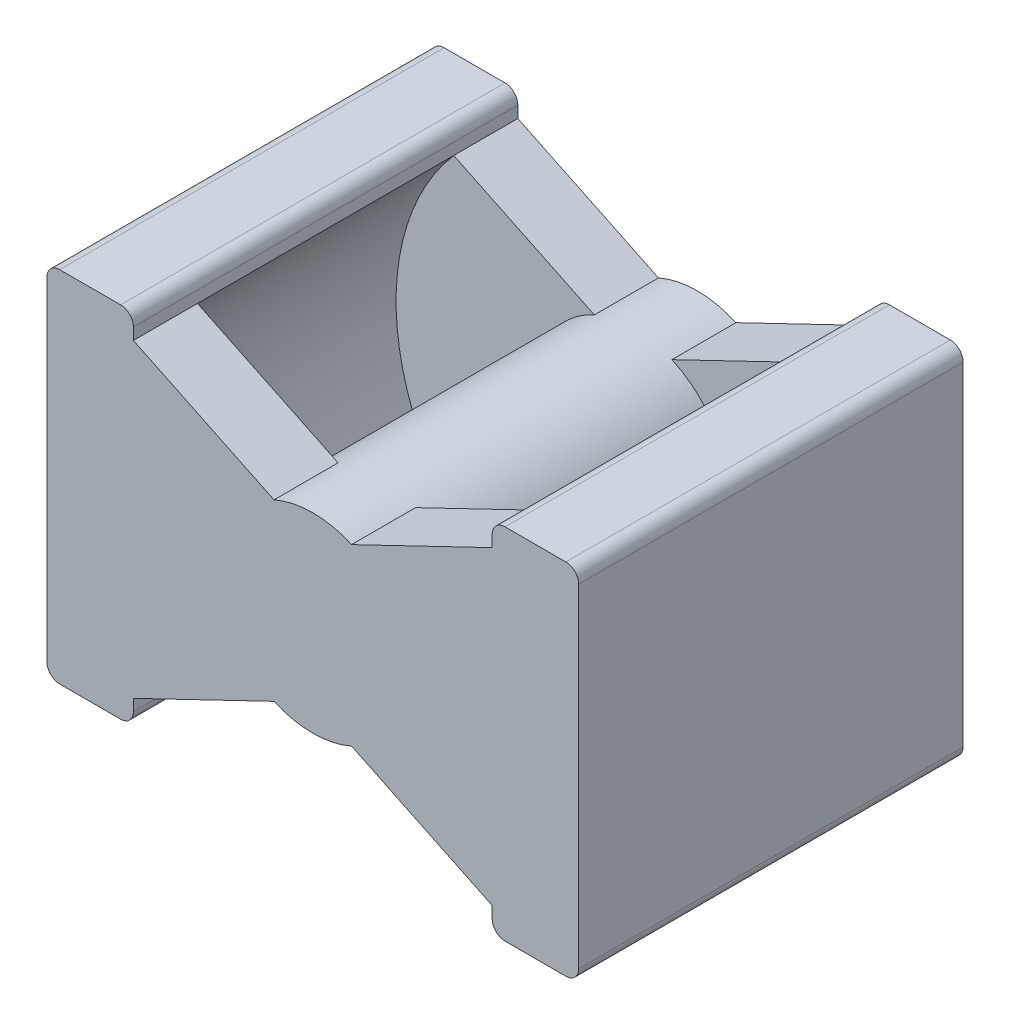
ISO-10303-21;
HEADER;
FILE_DESCRIPTION(('STEP AP214'),'2;1');
FILE_NAME('part.step','',(''),(''),'','','');
FILE_SCHEMA(('AUTOMOTIVE_DESIGN { 1 0 10303 214 1 1 1 1 }'));
ENDSEC;
DATA;
#1=APPLICATION_CONTEXT('core data for automotive mechanical design processes');
#2=APPLICATION_PROTOCOL_DEFINITION('international standard','automotive_design',2000,#1);
#3=PRODUCT_CONTEXT('',#1,'mechanical');
#4=PRODUCT('Part','Part','',(#3));
#5=PRODUCT_RELATED_PRODUCT_CATEGORY('part','',(#4));
#6=PRODUCT_DEFINITION_FORMATION('','',#4);
#7=PRODUCT_DEFINITION_CONTEXT('part definition',#1,'design');
#8=PRODUCT_DEFINITION('design','',#6,#7);
#9=PRODUCT_DEFINITION_SHAPE('','',#8);
#10=(LENGTH_UNIT() NAMED_UNIT(*) SI_UNIT(.MILLI.,.METRE.));
#11=(NAMED_UNIT(*) PLANE_ANGLE_UNIT() SI_UNIT($,.RADIAN.));
#12=(NAMED_UNIT(*) SI_UNIT($,.STERADIAN.) SOLID_ANGLE_UNIT());
#13=UNCERTAINTY_MEASURE_WITH_UNIT(LENGTH_MEASURE(1.E-05),#10,'distance_accuracy_value','');
#14=(GEOMETRIC_REPRESENTATION_CONTEXT(3) GLOBAL_UNCERTAINTY_ASSIGNED_CONTEXT((#13)) GLOBAL_UNIT_ASSIGNED_CONTEXT((#10,
#11,#12)) REPRESENTATION_CONTEXT('',''));
#15=CARTESIAN_POINT('',(0.,0.,0.));
#16=DIRECTION('',(0.,0.,1.));
#17=DIRECTION('',(1.,0.,0.));
#18=AXIS2_PLACEMENT_3D('',#15,#16,#17);
#19=CARTESIAN_POINT('',(0.525361672592803,-1.09094868808785,30.));
#20=DIRECTION('',(-0.433876012191163,0.900972588953234,0.));
#21=DIRECTION('',(-0.900972588953234,-0.433876012191164,0.));
#22=AXIS2_PLACEMENT_3D('',#19,#20,#21);
#23=PLANE('',#22);
#24=DIRECTION('',(-0.900972588953234,-0.433876012191164,0.));
#25=VECTOR('',#24,1.);
#26=CARTESIAN_POINT('',(0.525361672592803,-1.09094868808785,25.));
#27=LINE('',#26,#25);
#28=CARTESIAN_POINT('',(17.725,7.19177886669359,25.));
#29=VERTEX_POINT('',#28);
#30=CARTESIAN_POINT('',(6.75,1.90661337755218,25.));
#31=VERTEX_POINT('',#30);
#32=EDGE_CURVE('E518',#29,#31,#27,.T.);
#33=ORIENTED_EDGE('',*,*,#32,.F.);
#34=DIRECTION('',(0.,0.,-1.));
#35=VECTOR('',#34,1.);
#36=CARTESIAN_POINT('',(17.725,7.19177886669359,30.));
#37=LINE('',#36,#35);
#38=CARTESIAN_POINT('',(17.725,7.19177886669359,30.));
#39=VERTEX_POINT('',#38);
#40=EDGE_CURVE('E11',#39,#29,#37,.T.);
#41=ORIENTED_EDGE('',*,*,#40,.F.);
#42=DIRECTION('',(0.900972588953234,0.433876012191164,0.));
#43=VECTOR('',#42,1.);
#44=CARTESIAN_POINT('',(0.525361672592803,-1.09094868808785,30.));
#45=LINE('',#44,#43);
#46=CARTESIAN_POINT('',(6.75,1.90661337755218,30.));
#47=VERTEX_POINT('',#46);
#48=EDGE_CURVE('E396',#47,#39,#45,.T.);
#49=ORIENTED_EDGE('',*,*,#48,.F.);
#50=DIRECTION('',(0.,0.,-1.));
#51=VECTOR('',#50,1.);
#52=CARTESIAN_POINT('',(6.75,1.90661337755218,30.));
#53=LINE('',#52,#51);
#54=EDGE_CURVE('E397',#47,#31,#53,.T.);
#55=ORIENTED_EDGE('',*,*,#54,.T.);
#56=EDGE_LOOP('',(#33,#41,#49,#55));
#57=FACE_BOUND('',#56,.T.);
#58=ADVANCED_FACE('F39',(#57),#23,.F.);
#59=CARTESIAN_POINT('',(7.28694667653582,15.1318326624381,30.));
#60=DIRECTION('',(-0.433876012191163,-0.900972588953234,0.));
#61=DIRECTION('',(0.900972588953234,-0.433876012191163,0.));
#62=AXIS2_PLACEMENT_3D('',#59,#60,#61);
#63=PLANE('',#62);
#64=DIRECTION('',(0.,0.,-1.));
#65=VECTOR('',#64,1.);
#66=CARTESIAN_POINT('',(23.775,7.19177886669359,30.));
#67=LINE('',#66,#65);
#68=CARTESIAN_POINT('',(23.775,7.19177886669359,30.));
#69=VERTEX_POINT('',#68);
#70=CARTESIAN_POINT('',(23.775,7.19177886669359,25.));
#71=VERTEX_POINT('',#70);
#72=EDGE_CURVE('E313',#69,#71,#67,.T.);
#73=ORIENTED_EDGE('',*,*,#72,.T.);
#74=DIRECTION('',(0.900972588953234,-0.433876012191163,0.));
#75=VECTOR('',#74,1.);
#76=CARTESIAN_POINT('',(7.28694667653582,15.1318326624381,25.));
#77=LINE('',#76,#75);
#78=CARTESIAN_POINT('',(34.75,1.90661337755219,25.));
#79=VERTEX_POINT('',#78);
#80=EDGE_CURVE('E512',#71,#79,#77,.T.);
#81=ORIENTED_EDGE('',*,*,#80,.T.);
#82=DIRECTION('',(0.,0.,-1.));
#83=VECTOR('',#82,1.);
#84=CARTESIAN_POINT('',(34.75,1.90661337755218,30.));
#85=LINE('',#84,#83);
#86=CARTESIAN_POINT('',(34.75,1.90661337755218,30.));
#87=VERTEX_POINT('',#86);
#88=EDGE_CURVE('E310',#87,#79,#85,.T.);
#89=ORIENTED_EDGE('',*,*,#88,.F.);
#90=DIRECTION('',(-0.900972588953234,0.433876012191163,0.));
#91=VECTOR('',#90,1.);
#92=CARTESIAN_POINT('',(7.28694667653582,15.1318326624381,30.));
#93=LINE('',#92,#91);
#94=EDGE_CURVE('E470',#87,#69,#93,.T.);
#95=ORIENTED_EDGE('',*,*,#94,.T.);
#96=EDGE_LOOP('',(#73,#81,#89,#95));
#97=FACE_BOUND('',#96,.T.);
#98=ADVANCED_FACE('F558',(#97),#63,.T.);
#99=CARTESIAN_POINT('',(-3.65854435514435,7.59721230682451,30.));
#100=DIRECTION('',(0.433876012191163,-0.900972588953234,0.));
#101=DIRECTION('',(0.900972588953234,0.433876012191163,0.));
#102=AXIS2_PLACEMENT_3D('',#99,#100,#101);
#103=PLANE('',#102);
#104=DIRECTION('',(0.900972588953234,0.433876012191163,0.));
#105=VECTOR('',#104,1.);
#106=CARTESIAN_POINT('',(-3.65854435514435,7.59721230682451,25.));
#107=LINE('',#106,#105);
#108=CARTESIAN_POINT('',(23.775,20.8082211333064,25.));
#109=VERTEX_POINT('',#108);
#110=CARTESIAN_POINT('',(34.75,26.0933866224478,25.));
#111=VERTEX_POINT('',#110);
#112=EDGE_CURVE('E510',#109,#111,#107,.T.);
#113=ORIENTED_EDGE('',*,*,#112,.F.);
#114=DIRECTION('',(0.,0.,-1.));
#115=VECTOR('',#114,1.);
#116=CARTESIAN_POINT('',(23.775,20.8082211333064,30.));
#117=LINE('',#116,#115);
#118=CARTESIAN_POINT('',(23.775,20.8082211333064,30.));
#119=VERTEX_POINT('',#118);
#120=EDGE_CURVE('E282',#119,#109,#117,.T.);
#121=ORIENTED_EDGE('',*,*,#120,.F.);
#122=DIRECTION('',(-0.900972588953234,-0.433876012191163,0.));
#123=VECTOR('',#122,1.);
#124=CARTESIAN_POINT('',(-3.65854435514435,7.59721230682451,30.));
#125=LINE('',#124,#123);
#126=CARTESIAN_POINT('',(34.75,26.0933866224478,30.));
#127=VERTEX_POINT('',#126);
#128=EDGE_CURVE('E494',#127,#119,#125,.T.);
#129=ORIENTED_EDGE('',*,*,#128,.F.);
#130=DIRECTION('',(0.,0.,-1.));
#131=VECTOR('',#130,1.);
#132=CARTESIAN_POINT('',(34.75,26.0933866224478,30.));
#133=LINE('',#132,#131);
#134=EDGE_CURVE('E286',#127,#111,#133,.T.);
#135=ORIENTED_EDGE('',*,*,#134,.T.);
#136=EDGE_LOOP('',(#113,#121,#129,#135));
#137=FACE_BOUND('',#136,.T.);
#138=ADVANCED_FACE('F607',(#137),#103,.F.);
#139=CARTESIAN_POINT('',(11.470852704273,23.8199936573505,30.));
#140=DIRECTION('',(0.433876012191164,0.900972588953234,0.));
#141=DIRECTION('',(-0.900972588953234,0.433876012191164,0.));
#142=AXIS2_PLACEMENT_3D('',#139,#140,#141);
#143=PLANE('',#142);
#144=DIRECTION('',(0.,0.,-1.));
#145=VECTOR('',#144,1.);
#146=CARTESIAN_POINT('',(17.725,20.8082211333064,30.));
#147=LINE('',#146,#145);
#148=CARTESIAN_POINT('',(17.725,20.8082211333064,30.));
#149=VERTEX_POINT('',#148);
#150=CARTESIAN_POINT('',(17.725,20.8082211333064,25.));
#151=VERTEX_POINT('',#150);
#152=EDGE_CURVE('E273',#149,#151,#147,.T.);
#153=ORIENTED_EDGE('',*,*,#152,.T.);
#154=DIRECTION('',(-0.900972588953234,0.433876012191164,0.));
#155=VECTOR('',#154,1.);
#156=CARTESIAN_POINT('',(11.470852704273,23.8199936573505,25.));
#157=LINE('',#156,#155);
#158=CARTESIAN_POINT('',(6.75,26.0933866224478,25.));
#159=VERTEX_POINT('',#158);
#160=EDGE_CURVE('E506',#151,#159,#157,.T.);
#161=ORIENTED_EDGE('',*,*,#160,.T.);
#162=DIRECTION('',(0.,0.,-1.));
#163=VECTOR('',#162,1.);
#164=CARTESIAN_POINT('',(6.75,26.0933866224478,30.));
#165=LINE('',#164,#163);
#166=CARTESIAN_POINT('',(6.75,26.0933866224478,30.));
#167=VERTEX_POINT('',#166);
#168=EDGE_CURVE('E274',#167,#159,#165,.T.);
#169=ORIENTED_EDGE('',*,*,#168,.F.);
#170=DIRECTION('',(0.900972588953234,-0.433876012191164,0.));
#171=VECTOR('',#170,1.);
#172=CARTESIAN_POINT('',(11.470852704273,23.8199936573505,30.));
#173=LINE('',#172,#171);
#174=EDGE_CURVE('E496',#167,#149,#173,.T.);
#175=ORIENTED_EDGE('',*,*,#174,.T.);
#176=EDGE_LOOP('',(#153,#161,#169,#175));
#177=FACE_BOUND('',#176,.T.);
#178=ADVANCED_FACE('F504',(#177),#143,.T.);
#179=CARTESIAN_POINT('',(17.725,7.19177886669359,5.));
#180=VERTEX_POINT('',#179);
#181=CARTESIAN_POINT('',(17.725,7.19177886669359,0.));
#182=VERTEX_POINT('',#181);
#183=EDGE_CURVE('E47',#180,#182,#37,.T.);
#184=ORIENTED_EDGE('',*,*,#183,.F.);
#185=DIRECTION('',(-0.900972588953234,-0.433876012191164,0.));
#186=VECTOR('',#185,1.);
#187=CARTESIAN_POINT('',(0.525361672592803,-1.09094868808785,5.));
#188=LINE('',#187,#186);
#189=CARTESIAN_POINT('',(6.75,1.90661337755218,5.));
#190=VERTEX_POINT('',#189);
#191=EDGE_CURVE('E255',#180,#190,#188,.T.);
#192=ORIENTED_EDGE('',*,*,#191,.T.);
#193=CARTESIAN_POINT('',(6.75,1.90661337755218,0.));
#194=VERTEX_POINT('',#193);
#195=EDGE_CURVE('E402',#190,#194,#53,.T.);
#196=ORIENTED_EDGE('',*,*,#195,.T.);
#197=DIRECTION('',(0.900972588953234,0.433876012191164,0.));
#198=VECTOR('',#197,1.);
#199=CARTESIAN_POINT('',(0.525361672592803,-1.09094868808785,0.));
#200=LINE('',#199,#198);
#201=EDGE_CURVE('E333',#194,#182,#200,.T.);
#202=ORIENTED_EDGE('',*,*,#201,.T.);
#203=EDGE_LOOP('',(#184,#192,#196,#202));
#204=FACE_BOUND('',#203,.T.);
#205=ADVANCED_FACE('F41',(#204),#23,.F.);
#206=DIRECTION('',(0.900972588953234,-0.433876012191163,0.));
#207=VECTOR('',#206,1.);
#208=CARTESIAN_POINT('',(7.28694667653582,15.1318326624381,5.));
#209=LINE('',#208,#207);
#210=CARTESIAN_POINT('',(23.775,7.19177886669359,5.));
#211=VERTEX_POINT('',#210);
#212=CARTESIAN_POINT('',(34.75,1.90661337755218,5.));
#213=VERTEX_POINT('',#212);
#214=EDGE_CURVE('E327',#211,#213,#209,.T.);
#215=ORIENTED_EDGE('',*,*,#214,.F.);
#216=CARTESIAN_POINT('',(23.775,7.19177886669359,0.));
#217=VERTEX_POINT('',#216);
#218=EDGE_CURVE('E312',#211,#217,#67,.T.);
#219=ORIENTED_EDGE('',*,*,#218,.T.);
#220=DIRECTION('',(-0.900972588953234,0.433876012191163,0.));
#221=VECTOR('',#220,1.);
#222=CARTESIAN_POINT('',(7.28694667653582,15.1318326624381,0.));
#223=LINE('',#222,#221);
#224=CARTESIAN_POINT('',(34.75,1.90661337755218,0.));
#225=VERTEX_POINT('',#224);
#226=EDGE_CURVE('E326',#225,#217,#223,.T.);
#227=ORIENTED_EDGE('',*,*,#226,.F.);
#228=EDGE_CURVE('E309',#213,#225,#85,.T.);
#229=ORIENTED_EDGE('',*,*,#228,.F.);
#230=EDGE_LOOP('',(#215,#219,#227,#229));
#231=FACE_BOUND('',#230,.T.);
#232=ADVANCED_FACE('F323',(#231),#63,.T.);
#233=CARTESIAN_POINT('',(34.75,0.,30.));
#234=DIRECTION('',(1.,0.,0.));
#235=DIRECTION('',(0.,0.,-1.));
#236=AXIS2_PLACEMENT_3D('',#233,#234,#235);
#237=PLANE('',#236);
#238=DIRECTION('',(0.,-1.,0.));
#239=VECTOR('',#238,1.);
#240=CARTESIAN_POINT('',(34.75,0.,0.));
#241=LINE('',#240,#239);
#242=CARTESIAN_POINT('',(34.75,1.00000000000001,0.));
#243=VERTEX_POINT('',#242);
#244=EDGE_CURVE('E338',#225,#243,#241,.T.);
#245=ORIENTED_EDGE('',*,*,#244,.T.);
#246=DIRECTION('',(0.,0.,-1.));
#247=VECTOR('',#246,1.);
#248=CARTESIAN_POINT('',(34.75,1.00000000000001,30.));
#249=LINE('',#248,#247);
#250=CARTESIAN_POINT('',(34.75,1.00000000000001,30.));
#251=VERTEX_POINT('',#250);
#252=EDGE_CURVE('E306',#251,#243,#249,.T.);
#253=ORIENTED_EDGE('',*,*,#252,.F.);
#254=DIRECTION('',(0.,-1.,0.));
#255=VECTOR('',#254,1.);
#256=CARTESIAN_POINT('',(34.75,0.,30.));
#257=LINE('',#256,#255);
#258=EDGE_CURVE('E473',#87,#251,#257,.T.);
#259=ORIENTED_EDGE('',*,*,#258,.F.);
#260=ORIENTED_EDGE('',*,*,#88,.T.);
#261=DIRECTION('',(0.,0.,-1.));
#262=VECTOR('',#261,1.);
#263=CARTESIAN_POINT('',(34.75,1.90661337755219,25.));
#264=LINE('',#263,#262);
#265=EDGE_CURVE('E456',#79,#213,#264,.T.);
#266=ORIENTED_EDGE('',*,*,#265,.T.);
#267=ORIENTED_EDGE('',*,*,#228,.T.);
#268=EDGE_LOOP('',(#245,#253,#259,#260,#266,#267));
#269=FACE_BOUND('',#268,.T.);
#270=ADVANCED_FACE('F536',(#269),#237,.F.);
#271=CARTESIAN_POINT('',(35.75,1.,30.));
#272=DIRECTION('',(0.,0.,-1.));
#273=DIRECTION('',(-1.,0.,0.));
#274=AXIS2_PLACEMENT_3D('',#271,#272,#273);
#275=CYLINDRICAL_SURFACE('',#274,1.);
#276=CARTESIAN_POINT('',(35.75,1.,0.));
#277=DIRECTION('',(0.,0.,1.));
#278=DIRECTION('',(1.,0.,0.));
#279=AXIS2_PLACEMENT_3D('',#276,#277,#278);
#280=CIRCLE('',#279,1.);
#281=CARTESIAN_POINT('',(35.75,0.,0.));
#282=VERTEX_POINT('',#281);
#283=EDGE_CURVE('E340',#243,#282,#280,.T.);
#284=ORIENTED_EDGE('',*,*,#283,.T.);
#285=DIRECTION('',(0.,0.,-1.));
#286=VECTOR('',#285,1.);
#287=CARTESIAN_POINT('',(35.75,0.,30.));
#288=LINE('',#287,#286);
#289=CARTESIAN_POINT('',(35.75,0.,30.));
#290=VERTEX_POINT('',#289);
#291=EDGE_CURVE('E303',#290,#282,#288,.T.);
#292=ORIENTED_EDGE('',*,*,#291,.F.);
#293=CARTESIAN_POINT('',(35.75,1.,30.));
#294=DIRECTION('',(0.,0.,1.));
#295=DIRECTION('',(1.,0.,0.));
#296=AXIS2_PLACEMENT_3D('',#293,#294,#295);
#297=CIRCLE('',#296,1.);
#298=EDGE_CURVE('E475',#251,#290,#297,.T.);
#299=ORIENTED_EDGE('',*,*,#298,.F.);
#300=ORIENTED_EDGE('',*,*,#252,.T.);
#301=EDGE_LOOP('',(#284,#292,#299,#300));
#302=FACE_BOUND('',#301,.T.);
#303=ADVANCED_FACE('F541',(#302),#275,.T.);
#304=CARTESIAN_POINT('',(0.,0.,30.));
#305=DIRECTION('',(0.,1.,0.));
#306=DIRECTION('',(0.,0.,1.));
#307=AXIS2_PLACEMENT_3D('',#304,#305,#306);
#308=PLANE('',#307);
#309=DIRECTION('',(1.,0.,0.));
#310=VECTOR('',#309,1.);
#311=CARTESIAN_POINT('',(0.,0.,0.));
#312=LINE('',#311,#310);
#313=CARTESIAN_POINT('',(40.5,0.,0.));
#314=VERTEX_POINT('',#313);
#315=EDGE_CURVE('E345',#282,#314,#312,.T.);
#316=ORIENTED_EDGE('',*,*,#315,.T.);
#317=DIRECTION('',(0.,0.,-1.));
#318=VECTOR('',#317,1.);
#319=CARTESIAN_POINT('',(40.5,0.,30.));
#320=LINE('',#319,#318);
#321=CARTESIAN_POINT('',(40.5,0.,30.));
#322=VERTEX_POINT('',#321);
#323=EDGE_CURVE('E300',#322,#314,#320,.T.);
#324=ORIENTED_EDGE('',*,*,#323,.F.);
#325=DIRECTION('',(1.,0.,0.));
#326=VECTOR('',#325,1.);
#327=CARTESIAN_POINT('',(0.,0.,30.));
#328=LINE('',#327,#326);
#329=EDGE_CURVE('E477',#290,#322,#328,.T.);
#330=ORIENTED_EDGE('',*,*,#329,.F.);
#331=ORIENTED_EDGE('',*,*,#291,.T.);
#332=EDGE_LOOP('',(#316,#324,#330,#331));
#333=FACE_BOUND('',#332,.T.);
#334=ADVANCED_FACE('F548',(#333),#308,.F.);
#335=CARTESIAN_POINT('',(40.5,1.,30.));
#336=DIRECTION('',(0.,0.,-1.));
#337=DIRECTION('',(-1.,0.,0.));
#338=AXIS2_PLACEMENT_3D('',#335,#336,#337);
#339=CYLINDRICAL_SURFACE('',#338,1.);
#340=CARTESIAN_POINT('',(40.5,1.,0.));
#341=DIRECTION('',(0.,0.,1.));
#342=DIRECTION('',(1.,0.,0.));
#343=AXIS2_PLACEMENT_3D('',#340,#341,#342);
#344=CIRCLE('',#343,1.);
#345=CARTESIAN_POINT('',(41.5,1.00000000000001,0.));
#346=VERTEX_POINT('',#345);
#347=EDGE_CURVE('E347',#314,#346,#344,.T.);
#348=ORIENTED_EDGE('',*,*,#347,.T.);
#349=DIRECTION('',(0.,0.,-1.));
#350=VECTOR('',#349,1.);
#351=CARTESIAN_POINT('',(41.5,1.00000000000001,30.));
#352=LINE('',#351,#350);
#353=CARTESIAN_POINT('',(41.5,1.00000000000001,30.));
#354=VERTEX_POINT('',#353);
#355=EDGE_CURVE('E297',#354,#346,#352,.T.);
#356=ORIENTED_EDGE('',*,*,#355,.F.);
#357=CARTESIAN_POINT('',(40.5,1.,30.));
#358=DIRECTION('',(0.,0.,1.));
#359=DIRECTION('',(1.,0.,0.));
#360=AXIS2_PLACEMENT_3D('',#357,#358,#359);
#361=CIRCLE('',#360,1.);
#362=EDGE_CURVE('E479',#322,#354,#361,.T.);
#363=ORIENTED_EDGE('',*,*,#362,.F.);
#364=ORIENTED_EDGE('',*,*,#323,.T.);
#365=EDGE_LOOP('',(#348,#356,#363,#364));
#366=FACE_BOUND('',#365,.T.);
#367=ADVANCED_FACE('F552',(#366),#339,.T.);
#368=CARTESIAN_POINT('',(41.5,0.,30.));
#369=DIRECTION('',(-1.,0.,0.));
#370=DIRECTION('',(0.,0.,1.));
#371=AXIS2_PLACEMENT_3D('',#368,#369,#370);
#372=PLANE('',#371);
#373=DIRECTION('',(0.,1.,0.));
#374=VECTOR('',#373,1.);
#375=CARTESIAN_POINT('',(41.5,0.,0.));
#376=LINE('',#375,#374);
#377=CARTESIAN_POINT('',(41.5,27.,0.));
#378=VERTEX_POINT('',#377);
#379=EDGE_CURVE('E349',#346,#378,#376,.T.);
#380=ORIENTED_EDGE('',*,*,#379,.T.);
#381=DIRECTION('',(0.,0.,-1.));
#382=VECTOR('',#381,1.);
#383=CARTESIAN_POINT('',(41.5,27.,30.));
#384=LINE('',#383,#382);
#385=CARTESIAN_POINT('',(41.5,27.,30.));
#386=VERTEX_POINT('',#385);
#387=EDGE_CURVE('E295',#386,#378,#384,.T.);
#388=ORIENTED_EDGE('',*,*,#387,.F.);
#389=DIRECTION('',(0.,1.,0.));
#390=VECTOR('',#389,1.);
#391=CARTESIAN_POINT('',(41.5,0.,30.));
#392=LINE('',#391,#390);
#393=EDGE_CURVE('E481',#354,#386,#392,.T.);
#394=ORIENTED_EDGE('',*,*,#393,.F.);
#395=ORIENTED_EDGE('',*,*,#355,.T.);
#396=EDGE_LOOP('',(#380,#388,#394,#395));
#397=FACE_BOUND('',#396,.T.);
#398=ADVANCED_FACE('F647',(#397),#372,.F.);
#399=CARTESIAN_POINT('',(40.5,27.,30.));
#400=DIRECTION('',(0.,0.,-1.));
#401=DIRECTION('',(-1.,0.,0.));
#402=AXIS2_PLACEMENT_3D('',#399,#400,#401);
#403=CYLINDRICAL_SURFACE('',#402,1.);
#404=CARTESIAN_POINT('',(40.5,27.,0.));
#405=DIRECTION('',(0.,0.,1.));
#406=DIRECTION('',(1.,0.,0.));
#407=AXIS2_PLACEMENT_3D('',#404,#405,#406);
#408=CIRCLE('',#407,1.);
#409=CARTESIAN_POINT('',(40.5,28.,0.));
#410=VERTEX_POINT('',#409);
#411=EDGE_CURVE('E352',#410,#378,#408,.F.);
#412=ORIENTED_EDGE('',*,*,#411,.F.);
#413=DIRECTION('',(0.,0.,-1.));
#414=VECTOR('',#413,1.);
#415=CARTESIAN_POINT('',(40.5,28.,30.));
#416=LINE('',#415,#414);
#417=CARTESIAN_POINT('',(40.5,28.,30.));
#418=VERTEX_POINT('',#417);
#419=EDGE_CURVE('E293',#418,#410,#416,.T.);
#420=ORIENTED_EDGE('',*,*,#419,.F.);
#421=CARTESIAN_POINT('',(40.5,27.,30.));
#422=DIRECTION('',(0.,0.,1.));
#423=DIRECTION('',(1.,0.,0.));
#424=AXIS2_PLACEMENT_3D('',#421,#422,#423);
#425=CIRCLE('',#424,1.);
#426=EDGE_CURVE('E483',#418,#386,#425,.F.);
#427=ORIENTED_EDGE('',*,*,#426,.T.);
#428=ORIENTED_EDGE('',*,*,#387,.T.);
#429=EDGE_LOOP('',(#412,#420,#427,#428));
#430=FACE_BOUND('',#429,.T.);
#431=ADVANCED_FACE('F643',(#430),#403,.T.);
#432=CARTESIAN_POINT('',(0.,28.,30.));
#433=DIRECTION('',(0.,1.,0.));
#434=DIRECTION('',(0.,0.,1.));
#435=AXIS2_PLACEMENT_3D('',#432,#433,#434);
#436=PLANE('',#435);
#437=DIRECTION('',(1.,0.,0.));
#438=VECTOR('',#437,1.);
#439=CARTESIAN_POINT('',(0.,28.,0.));
#440=LINE('',#439,#438);
#441=CARTESIAN_POINT('',(35.75,28.,0.));
#442=VERTEX_POINT('',#441);
#443=EDGE_CURVE('E355',#442,#410,#440,.T.);
#444=ORIENTED_EDGE('',*,*,#443,.F.);
#445=DIRECTION('',(0.,0.,-1.));
#446=VECTOR('',#445,1.);
#447=CARTESIAN_POINT('',(35.75,28.,30.));
#448=LINE('',#447,#446);
#449=CARTESIAN_POINT('',(35.75,28.,30.));
#450=VERTEX_POINT('',#449);
#451=EDGE_CURVE('E291',#450,#442,#448,.T.);
#452=ORIENTED_EDGE('',*,*,#451,.F.);
#453=DIRECTION('',(1.,0.,0.));
#454=VECTOR('',#453,1.);
#455=CARTESIAN_POINT('',(0.,28.,30.));
#456=LINE('',#455,#454);
#457=EDGE_CURVE('E486',#450,#418,#456,.T.);
#458=ORIENTED_EDGE('',*,*,#457,.T.);
#459=ORIENTED_EDGE('',*,*,#419,.T.);
#460=EDGE_LOOP('',(#444,#452,#458,#459));
#461=FACE_BOUND('',#460,.T.);
#462=ADVANCED_FACE('F639',(#461),#436,.T.);
#463=CARTESIAN_POINT('',(35.75,27.,30.));
#464=DIRECTION('',(0.,0.,-1.));
#465=DIRECTION('',(-1.,0.,0.));
#466=AXIS2_PLACEMENT_3D('',#463,#464,#465);
#467=CYLINDRICAL_SURFACE('',#466,1.);
#468=CARTESIAN_POINT('',(35.75,27.,0.));
#469=DIRECTION('',(0.,0.,1.));
#470=DIRECTION('',(1.,0.,0.));
#471=AXIS2_PLACEMENT_3D('',#468,#469,#470);
#472=CIRCLE('',#471,1.);
#473=CARTESIAN_POINT('',(34.75,27.,0.));
#474=VERTEX_POINT('',#473);
#475=EDGE_CURVE('E358',#474,#442,#472,.F.);
#476=ORIENTED_EDGE('',*,*,#475,.F.);
#477=DIRECTION('',(0.,0.,-1.));
#478=VECTOR('',#477,1.);
#479=CARTESIAN_POINT('',(34.75,27.,30.));
#480=LINE('',#479,#478);
#481=CARTESIAN_POINT('',(34.75,27.,30.));
#482=VERTEX_POINT('',#481);
#483=EDGE_CURVE('E289',#482,#474,#480,.T.);
#484=ORIENTED_EDGE('',*,*,#483,.F.);
#485=CARTESIAN_POINT('',(35.75,27.,30.));
#486=DIRECTION('',(0.,0.,1.));
#487=DIRECTION('',(1.,0.,0.));
#488=AXIS2_PLACEMENT_3D('',#485,#486,#487);
#489=CIRCLE('',#488,1.);
#490=EDGE_CURVE('E489',#482,#450,#489,.F.);
#491=ORIENTED_EDGE('',*,*,#490,.T.);
#492=ORIENTED_EDGE('',*,*,#451,.T.);
#493=EDGE_LOOP('',(#476,#484,#491,#492));
#494=FACE_BOUND('',#493,.T.);
#495=ADVANCED_FACE('F635',(#494),#467,.T.);
#496=CARTESIAN_POINT('',(34.75,0.,30.));
#497=DIRECTION('',(1.,0.,0.));
#498=DIRECTION('',(0.,0.,-1.));
#499=AXIS2_PLACEMENT_3D('',#496,#497,#498);
#500=PLANE('',#499);
#501=DIRECTION('',(0.,-1.,0.));
#502=VECTOR('',#501,1.);
#503=CARTESIAN_POINT('',(34.75,0.,0.));
#504=LINE('',#503,#502);
#505=CARTESIAN_POINT('',(34.75,26.0933866224478,0.));
#506=VERTEX_POINT('',#505);
#507=EDGE_CURVE('E361',#474,#506,#504,.T.);
#508=ORIENTED_EDGE('',*,*,#507,.T.);
#509=CARTESIAN_POINT('',(34.75,26.0933866224478,5.));
#510=VERTEX_POINT('',#509);
#511=EDGE_CURVE('E285',#510,#506,#133,.T.);
#512=ORIENTED_EDGE('',*,*,#511,.F.);
#513=DIRECTION('',(0.,0.,-1.));
#514=VECTOR('',#513,1.);
#515=CARTESIAN_POINT('',(34.75,26.0933866224478,25.));
#516=LINE('',#515,#514);
#517=EDGE_CURVE('E459',#510,#111,#516,.F.);
#518=ORIENTED_EDGE('',*,*,#517,.T.);
#519=ORIENTED_EDGE('',*,*,#134,.F.);
#520=DIRECTION('',(0.,-1.,0.));
#521=VECTOR('',#520,1.);
#522=CARTESIAN_POINT('',(34.75,0.,30.));
#523=LINE('',#522,#521);
#524=EDGE_CURVE('E492',#482,#127,#523,.T.);
#525=ORIENTED_EDGE('',*,*,#524,.F.);
#526=ORIENTED_EDGE('',*,*,#483,.T.);
#527=EDGE_LOOP('',(#508,#512,#518,#519,#525,#526));
#528=FACE_BOUND('',#527,.T.);
#529=ADVANCED_FACE('F630',(#528),#500,.F.);
#530=CARTESIAN_POINT('',(23.775,20.8082211333064,5.));
#531=VERTEX_POINT('',#530);
#532=CARTESIAN_POINT('',(23.775,20.8082211333064,0.));
#533=VERTEX_POINT('',#532);
#534=EDGE_CURVE('E277',#531,#533,#117,.T.);
#535=ORIENTED_EDGE('',*,*,#534,.F.);
#536=DIRECTION('',(0.900972588953234,0.433876012191163,0.));
#537=VECTOR('',#536,1.);
#538=CARTESIAN_POINT('',(-3.65854435514435,7.59721230682451,5.));
#539=LINE('',#538,#537);
#540=EDGE_CURVE('E266',#531,#510,#539,.T.);
#541=ORIENTED_EDGE('',*,*,#540,.T.);
#542=ORIENTED_EDGE('',*,*,#511,.T.);
#543=DIRECTION('',(-0.900972588953234,-0.433876012191163,0.));
#544=VECTOR('',#543,1.);
#545=CARTESIAN_POINT('',(-3.65854435514435,7.59721230682451,0.));
#546=LINE('',#545,#544);
#547=EDGE_CURVE('E364',#506,#533,#546,.T.);
#548=ORIENTED_EDGE('',*,*,#547,.T.);
#549=EDGE_LOOP('',(#535,#541,#542,#548));
#550=FACE_BOUND('',#549,.T.);
#551=ADVANCED_FACE('F619',(#550),#103,.F.);
#552=CARTESIAN_POINT('',(20.75,14.,30.));
#553=DIRECTION('',(0.,0.,-1.));
#554=DIRECTION('',(-1.,0.,0.));
#555=AXIS2_PLACEMENT_3D('',#552,#553,#554);
#556=CYLINDRICAL_SURFACE('',#555,7.45);
#557=ORIENTED_EDGE('',*,*,#40,.T.);
#558=CARTESIAN_POINT('',(20.75,14.,25.));
#559=DIRECTION('',(0.,0.,-1.));
#560=DIRECTION('',(-1.,0.,0.));
#561=AXIS2_PLACEMENT_3D('',#558,#559,#560);
#562=CIRCLE('',#561,7.45);
#563=EDGE_CURVE('E566',#29,#151,#562,.T.);
#564=ORIENTED_EDGE('',*,*,#563,.T.);
#565=ORIENTED_EDGE('',*,*,#152,.F.);
#566=CARTESIAN_POINT('',(20.75,14.,30.));
#567=DIRECTION('',(0.,0.,1.));
#568=DIRECTION('',(1.,0.,0.));
#569=AXIS2_PLACEMENT_3D('',#566,#567,#568);
#570=CIRCLE('',#569,7.45);
#571=EDGE_CURVE('E471',#119,#149,#570,.T.);
#572=ORIENTED_EDGE('',*,*,#571,.F.);
#573=ORIENTED_EDGE('',*,*,#120,.T.);
#574=EDGE_CURVE('E531',#109,#71,#562,.T.);
#575=ORIENTED_EDGE('',*,*,#574,.T.);
#576=ORIENTED_EDGE('',*,*,#72,.F.);
#577=EDGE_CURVE('E468',#39,#69,#570,.T.);
#578=ORIENTED_EDGE('',*,*,#577,.F.);
#579=EDGE_LOOP('',(#557,#564,#565,#572,#573,#575,#576,#578));
#580=FACE_BOUND('',#579,.T.);
#581=CARTESIAN_POINT('',(17.725,20.8082211333064,5.));
#582=VERTEX_POINT('',#581);
#583=CARTESIAN_POINT('',(17.725,20.8082211333064,0.));
#584=VERTEX_POINT('',#583);
#585=EDGE_CURVE('E262',#582,#584,#147,.T.);
#586=ORIENTED_EDGE('',*,*,#585,.F.);
#587=CARTESIAN_POINT('',(20.75,14.,5.));
#588=DIRECTION('',(0.,0.,-1.));
#589=DIRECTION('',(-1.,0.,0.));
#590=AXIS2_PLACEMENT_3D('',#587,#588,#589);
#591=CIRCLE('',#590,7.45);
#592=EDGE_CURVE('E248',#180,#582,#591,.T.);
#593=ORIENTED_EDGE('',*,*,#592,.F.);
#594=ORIENTED_EDGE('',*,*,#183,.T.);
#595=CARTESIAN_POINT('',(20.75,14.,0.));
#596=DIRECTION('',(0.,0.,1.));
#597=DIRECTION('',(1.,0.,0.));
#598=AXIS2_PLACEMENT_3D('',#595,#596,#597);
#599=CIRCLE('',#598,7.45);
#600=EDGE_CURVE('E329',#182,#217,#599,.T.);
#601=ORIENTED_EDGE('',*,*,#600,.T.);
#602=ORIENTED_EDGE('',*,*,#218,.F.);
#603=EDGE_CURVE('E62',#531,#211,#591,.T.);
#604=ORIENTED_EDGE('',*,*,#603,.F.);
#605=ORIENTED_EDGE('',*,*,#534,.T.);
#606=EDGE_CURVE('E271',#533,#584,#599,.T.);
#607=ORIENTED_EDGE('',*,*,#606,.T.);
#608=EDGE_LOOP('',(#586,#593,#594,#601,#602,#604,#605,#607));
#609=FACE_BOUND('',#608,.T.);
#610=ADVANCED_FACE('F269',(#580,#609),#556,.T.);
#611=DIRECTION('',(-0.900972588953234,0.433876012191164,0.));
#612=VECTOR('',#611,1.);
#613=CARTESIAN_POINT('',(11.470852704273,23.8199936573505,5.));
#614=LINE('',#613,#612);
#615=CARTESIAN_POINT('',(6.75,26.0933866224478,5.));
#616=VERTEX_POINT('',#615);
#617=EDGE_CURVE('E252',#582,#616,#614,.T.);
#618=ORIENTED_EDGE('',*,*,#617,.F.);
#619=ORIENTED_EDGE('',*,*,#585,.T.);
#620=DIRECTION('',(0.900972588953234,-0.433876012191164,0.));
#621=VECTOR('',#620,1.);
#622=CARTESIAN_POINT('',(11.470852704273,23.8199936573505,0.));
#623=LINE('',#622,#621);
#624=CARTESIAN_POINT('',(6.75,26.0933866224478,0.));
#625=VERTEX_POINT('',#624);
#626=EDGE_CURVE('E367',#625,#584,#623,.T.);
#627=ORIENTED_EDGE('',*,*,#626,.F.);
#628=EDGE_CURVE('E264',#616,#625,#165,.T.);
#629=ORIENTED_EDGE('',*,*,#628,.F.);
#630=EDGE_LOOP('',(#618,#619,#627,#629));
#631=FACE_BOUND('',#630,.T.);
#632=ADVANCED_FACE('F260',(#631),#143,.T.);
#633=CARTESIAN_POINT('',(6.75,0.,30.));
#634=DIRECTION('',(1.,0.,0.));
#635=DIRECTION('',(0.,0.,-1.));
#636=AXIS2_PLACEMENT_3D('',#633,#634,#635);
#637=PLANE('',#636);
#638=DIRECTION('',(0.,-1.,0.));
#639=VECTOR('',#638,1.);
#640=CARTESIAN_POINT('',(6.75,0.,0.));
#641=LINE('',#640,#639);
#642=CARTESIAN_POINT('',(6.75,27.,0.));
#643=VERTEX_POINT('',#642);
#644=EDGE_CURVE('E369',#643,#625,#641,.T.);
#645=ORIENTED_EDGE('',*,*,#644,.F.);
#646=DIRECTION('',(0.,0.,-1.));
#647=VECTOR('',#646,1.);
#648=CARTESIAN_POINT('',(6.75,27.,30.));
#649=LINE('',#648,#647);
#650=CARTESIAN_POINT('',(6.75,27.,30.));
#651=VERTEX_POINT('',#650);
#652=EDGE_CURVE('E415',#651,#643,#649,.T.);
#653=ORIENTED_EDGE('',*,*,#652,.F.);
#654=DIRECTION('',(0.,-1.,0.));
#655=VECTOR('',#654,1.);
#656=CARTESIAN_POINT('',(6.75,0.,30.));
#657=LINE('',#656,#655);
#658=EDGE_CURVE('E440',#651,#167,#657,.T.);
#659=ORIENTED_EDGE('',*,*,#658,.T.);
#660=ORIENTED_EDGE('',*,*,#168,.T.);
#661=DIRECTION('',(0.,0.,-1.));
#662=VECTOR('',#661,1.);
#663=CARTESIAN_POINT('',(6.75,26.0933866224478,25.));
#664=LINE('',#663,#662);
#665=EDGE_CURVE('E422',#616,#159,#664,.F.);
#666=ORIENTED_EDGE('',*,*,#665,.F.);
#667=ORIENTED_EDGE('',*,*,#628,.T.);
#668=EDGE_LOOP('',(#645,#653,#659,#660,#666,#667));
#669=FACE_BOUND('',#668,.T.);
#670=ADVANCED_FACE('F421',(#669),#637,.T.);
#671=CARTESIAN_POINT('',(5.75,27.,30.));
#672=DIRECTION('',(0.,0.,-1.));
#673=DIRECTION('',(-1.,0.,0.));
#674=AXIS2_PLACEMENT_3D('',#671,#672,#673);
#675=CYLINDRICAL_SURFACE('',#674,1.);
#676=CARTESIAN_POINT('',(5.75,27.,0.));
#677=DIRECTION('',(0.,0.,1.));
#678=DIRECTION('',(1.,0.,0.));
#679=AXIS2_PLACEMENT_3D('',#676,#677,#678);
#680=CIRCLE('',#679,1.);
#681=CARTESIAN_POINT('',(5.74999999999999,28.,0.));
#682=VERTEX_POINT('',#681);
#683=EDGE_CURVE('E372',#643,#682,#680,.T.);
#684=ORIENTED_EDGE('',*,*,#683,.T.);
#685=DIRECTION('',(0.,0.,-1.));
#686=VECTOR('',#685,1.);
#687=CARTESIAN_POINT('',(5.74999999999999,28.,30.));
#688=LINE('',#687,#686);
#689=CARTESIAN_POINT('',(5.74999999999999,28.,30.));
#690=VERTEX_POINT('',#689);
#691=EDGE_CURVE('E414',#690,#682,#688,.T.);
#692=ORIENTED_EDGE('',*,*,#691,.F.);
#693=CARTESIAN_POINT('',(5.75,27.,30.));
#694=DIRECTION('',(0.,0.,1.));
#695=DIRECTION('',(1.,0.,0.));
#696=AXIS2_PLACEMENT_3D('',#693,#694,#695);
#697=CIRCLE('',#696,1.);
#698=EDGE_CURVE('E427',#651,#690,#697,.T.);
#699=ORIENTED_EDGE('',*,*,#698,.F.);
#700=ORIENTED_EDGE('',*,*,#652,.T.);
#701=EDGE_LOOP('',(#684,#692,#699,#700));
#702=FACE_BOUND('',#701,.T.);
#703=ADVANCED_FACE('F425',(#702),#675,.T.);
#704=CARTESIAN_POINT('',(0.,28.,30.));
#705=DIRECTION('',(0.,1.,0.));
#706=DIRECTION('',(0.,0.,1.));
#707=AXIS2_PLACEMENT_3D('',#704,#705,#706);
#708=PLANE('',#707);
#709=DIRECTION('',(1.,0.,0.));
#710=VECTOR('',#709,1.);
#711=CARTESIAN_POINT('',(0.,28.,0.));
#712=LINE('',#711,#710);
#713=CARTESIAN_POINT('',(1.00000000000001,28.,0.));
#714=VERTEX_POINT('',#713);
#715=EDGE_CURVE('E375',#714,#682,#712,.T.);
#716=ORIENTED_EDGE('',*,*,#715,.F.);
#717=DIRECTION('',(0.,0.,-1.));
#718=VECTOR('',#717,1.);
#719=CARTESIAN_POINT('',(1.00000000000001,28.,30.));
#720=LINE('',#719,#718);
#721=CARTESIAN_POINT('',(1.00000000000001,28.,30.));
#722=VERTEX_POINT('',#721);
#723=EDGE_CURVE('E412',#722,#714,#720,.T.);
#724=ORIENTED_EDGE('',*,*,#723,.F.);
#725=DIRECTION('',(1.,0.,0.));
#726=VECTOR('',#725,1.);
#727=CARTESIAN_POINT('',(0.,28.,30.));
#728=LINE('',#727,#726);
#729=EDGE_CURVE('E431',#722,#690,#728,.T.);
#730=ORIENTED_EDGE('',*,*,#729,.T.);
#731=ORIENTED_EDGE('',*,*,#691,.T.);
#732=EDGE_LOOP('',(#716,#724,#730,#731));
#733=FACE_BOUND('',#732,.T.);
#734=ADVANCED_FACE('F432',(#733),#708,.T.);
#735=CARTESIAN_POINT('',(1.,27.,30.));
#736=DIRECTION('',(0.,0.,-1.));
#737=DIRECTION('',(-1.,0.,0.));
#738=AXIS2_PLACEMENT_3D('',#735,#736,#737);
#739=CYLINDRICAL_SURFACE('',#738,1.);
#740=CARTESIAN_POINT('',(1.,27.,0.));
#741=DIRECTION('',(0.,0.,1.));
#742=DIRECTION('',(1.,0.,0.));
#743=AXIS2_PLACEMENT_3D('',#740,#741,#742);
#744=CIRCLE('',#743,1.);
#745=CARTESIAN_POINT('',(0.,27.,0.));
#746=VERTEX_POINT('',#745);
#747=EDGE_CURVE('E378',#746,#714,#744,.F.);
#748=ORIENTED_EDGE('',*,*,#747,.F.);
#749=DIRECTION('',(0.,0.,-1.));
#750=VECTOR('',#749,1.);
#751=CARTESIAN_POINT('',(0.,27.,30.));
#752=LINE('',#751,#750);
#753=CARTESIAN_POINT('',(0.,27.,30.));
#754=VERTEX_POINT('',#753);
#755=EDGE_CURVE('E410',#754,#746,#752,.T.);
#756=ORIENTED_EDGE('',*,*,#755,.F.);
#757=CARTESIAN_POINT('',(1.,27.,30.));
#758=DIRECTION('',(0.,0.,1.));
#759=DIRECTION('',(1.,0.,0.));
#760=AXIS2_PLACEMENT_3D('',#757,#758,#759);
#761=CIRCLE('',#760,1.);
#762=EDGE_CURVE('E436',#754,#722,#761,.F.);
#763=ORIENTED_EDGE('',*,*,#762,.T.);
#764=ORIENTED_EDGE('',*,*,#723,.T.);
#765=EDGE_LOOP('',(#748,#756,#763,#764));
#766=FACE_BOUND('',#765,.T.);
#767=ADVANCED_FACE('F593',(#766),#739,.T.);
#768=CARTESIAN_POINT('',(0.,0.,30.));
#769=DIRECTION('',(-1.,0.,0.));
#770=DIRECTION('',(0.,0.,1.));
#771=AXIS2_PLACEMENT_3D('',#768,#769,#770);
#772=PLANE('',#771);
#773=DIRECTION('',(0.,1.,0.));
#774=VECTOR('',#773,1.);
#775=CARTESIAN_POINT('',(0.,0.,0.));
#776=LINE('',#775,#774);
#777=CARTESIAN_POINT('',(0.,1.00000000000001,0.));
#778=VERTEX_POINT('',#777);
#779=EDGE_CURVE('E381',#778,#746,#776,.T.);
#780=ORIENTED_EDGE('',*,*,#779,.F.);
#781=DIRECTION('',(0.,0.,-1.));
#782=VECTOR('',#781,1.);
#783=CARTESIAN_POINT('',(0.,1.00000000000001,30.));
#784=LINE('',#783,#782);
#785=CARTESIAN_POINT('',(0.,1.00000000000001,30.));
#786=VERTEX_POINT('',#785);
#787=EDGE_CURVE('E408',#786,#778,#784,.T.);
#788=ORIENTED_EDGE('',*,*,#787,.F.);
#789=DIRECTION('',(0.,1.,0.));
#790=VECTOR('',#789,1.);
#791=CARTESIAN_POINT('',(0.,0.,30.));
#792=LINE('',#791,#790);
#793=EDGE_CURVE('E438',#786,#754,#792,.T.);
#794=ORIENTED_EDGE('',*,*,#793,.T.);
#795=ORIENTED_EDGE('',*,*,#755,.T.);
#796=EDGE_LOOP('',(#780,#788,#794,#795));
#797=FACE_BOUND('',#796,.T.);
#798=ADVANCED_FACE('F590',(#797),#772,.T.);
#799=CARTESIAN_POINT('',(1.,1.,30.));
#800=DIRECTION('',(0.,0.,-1.));
#801=DIRECTION('',(-1.,0.,0.));
#802=AXIS2_PLACEMENT_3D('',#799,#800,#801);
#803=CYLINDRICAL_SURFACE('',#802,1.);
#804=CARTESIAN_POINT('',(1.,1.,0.));
#805=DIRECTION('',(0.,0.,1.));
#806=DIRECTION('',(1.,0.,0.));
#807=AXIS2_PLACEMENT_3D('',#804,#805,#806);
#808=CIRCLE('',#807,1.);
#809=CARTESIAN_POINT('',(1.00000000000001,0.,0.));
#810=VERTEX_POINT('',#809);
#811=EDGE_CURVE('E384',#810,#778,#808,.F.);
#812=ORIENTED_EDGE('',*,*,#811,.F.);
#813=DIRECTION('',(0.,0.,-1.));
#814=VECTOR('',#813,1.);
#815=CARTESIAN_POINT('',(1.00000000000001,0.,30.));
#816=LINE('',#815,#814);
#817=CARTESIAN_POINT('',(1.00000000000001,0.,30.));
#818=VERTEX_POINT('',#817);
#819=EDGE_CURVE('E406',#818,#810,#816,.T.);
#820=ORIENTED_EDGE('',*,*,#819,.F.);
#821=CARTESIAN_POINT('',(1.,1.,30.));
#822=DIRECTION('',(0.,0.,1.));
#823=DIRECTION('',(1.,0.,0.));
#824=AXIS2_PLACEMENT_3D('',#821,#822,#823);
#825=CIRCLE('',#824,1.);
#826=EDGE_CURVE('E446',#818,#786,#825,.F.);
#827=ORIENTED_EDGE('',*,*,#826,.T.);
#828=ORIENTED_EDGE('',*,*,#787,.T.);
#829=EDGE_LOOP('',(#812,#820,#827,#828));
#830=FACE_BOUND('',#829,.T.);
#831=ADVANCED_FACE('F584',(#830),#803,.T.);
#832=CARTESIAN_POINT('',(0.,0.,30.));
#833=DIRECTION('',(0.,1.,0.));
#834=DIRECTION('',(0.,0.,1.));
#835=AXIS2_PLACEMENT_3D('',#832,#833,#834);
#836=PLANE('',#835);
#837=DIRECTION('',(1.,0.,0.));
#838=VECTOR('',#837,1.);
#839=CARTESIAN_POINT('',(0.,0.,0.));
#840=LINE('',#839,#838);
#841=CARTESIAN_POINT('',(5.74999999999999,0.,0.));
#842=VERTEX_POINT('',#841);
#843=EDGE_CURVE('E387',#810,#842,#840,.T.);
#844=ORIENTED_EDGE('',*,*,#843,.T.);
#845=DIRECTION('',(0.,0.,-1.));
#846=VECTOR('',#845,1.);
#847=CARTESIAN_POINT('',(5.74999999999999,0.,30.));
#848=LINE('',#847,#846);
#849=CARTESIAN_POINT('',(5.74999999999999,0.,30.));
#850=VERTEX_POINT('',#849);
#851=EDGE_CURVE('E404',#850,#842,#848,.T.);
#852=ORIENTED_EDGE('',*,*,#851,.F.);
#853=DIRECTION('',(1.,0.,0.));
#854=VECTOR('',#853,1.);
#855=CARTESIAN_POINT('',(0.,0.,30.));
#856=LINE('',#855,#854);
#857=EDGE_CURVE('E449',#818,#850,#856,.T.);
#858=ORIENTED_EDGE('',*,*,#857,.F.);
#859=ORIENTED_EDGE('',*,*,#819,.T.);
#860=EDGE_LOOP('',(#844,#852,#858,#859));
#861=FACE_BOUND('',#860,.T.);
#862=ADVANCED_FACE('F594',(#861),#836,.F.);
#863=CARTESIAN_POINT('',(5.75,1.,30.));
#864=DIRECTION('',(0.,0.,-1.));
#865=DIRECTION('',(-1.,0.,0.));
#866=AXIS2_PLACEMENT_3D('',#863,#864,#865);
#867=CYLINDRICAL_SURFACE('',#866,1.);
#868=CARTESIAN_POINT('',(5.75,1.,0.));
#869=DIRECTION('',(0.,0.,1.));
#870=DIRECTION('',(1.,0.,0.));
#871=AXIS2_PLACEMENT_3D('',#868,#869,#870);
#872=CIRCLE('',#871,1.);
#873=CARTESIAN_POINT('',(6.75,1.00000000000001,0.));
#874=VERTEX_POINT('',#873);
#875=EDGE_CURVE('E390',#874,#842,#872,.F.);
#876=ORIENTED_EDGE('',*,*,#875,.F.);
#877=DIRECTION('',(0.,0.,-1.));
#878=VECTOR('',#877,1.);
#879=CARTESIAN_POINT('',(6.75,1.00000000000001,30.));
#880=LINE('',#879,#878);
#881=CARTESIAN_POINT('',(6.75,1.00000000000001,30.));
#882=VERTEX_POINT('',#881);
#883=EDGE_CURVE('E400',#882,#874,#880,.T.);
#884=ORIENTED_EDGE('',*,*,#883,.F.);
#885=CARTESIAN_POINT('',(5.75,1.,30.));
#886=DIRECTION('',(0.,0.,1.));
#887=DIRECTION('',(1.,0.,0.));
#888=AXIS2_PLACEMENT_3D('',#885,#886,#887);
#889=CIRCLE('',#888,1.);
#890=EDGE_CURVE('E451',#882,#850,#889,.F.);
#891=ORIENTED_EDGE('',*,*,#890,.T.);
#892=ORIENTED_EDGE('',*,*,#851,.T.);
#893=EDGE_LOOP('',(#876,#884,#891,#892));
#894=FACE_BOUND('',#893,.T.);
#895=ADVANCED_FACE('F578',(#894),#867,.T.);
#896=CARTESIAN_POINT('',(6.75,0.,30.));
#897=DIRECTION('',(1.,0.,0.));
#898=DIRECTION('',(0.,0.,-1.));
#899=AXIS2_PLACEMENT_3D('',#896,#897,#898);
#900=PLANE('',#899);
#901=DIRECTION('',(0.,-1.,0.));
#902=VECTOR('',#901,1.);
#903=CARTESIAN_POINT('',(6.75,0.,0.));
#904=LINE('',#903,#902);
#905=EDGE_CURVE('E393',#194,#874,#904,.T.);
#906=ORIENTED_EDGE('',*,*,#905,.F.);
#907=ORIENTED_EDGE('',*,*,#195,.F.);
#908=EDGE_CURVE('E401',#31,#190,#53,.T.);
#909=ORIENTED_EDGE('',*,*,#908,.F.);
#910=ORIENTED_EDGE('',*,*,#54,.F.);
#911=DIRECTION('',(0.,-1.,0.));
#912=VECTOR('',#911,1.);
#913=CARTESIAN_POINT('',(6.75,0.,30.));
#914=LINE('',#913,#912);
#915=EDGE_CURVE('E454',#47,#882,#914,.T.);
#916=ORIENTED_EDGE('',*,*,#915,.T.);
#917=ORIENTED_EDGE('',*,*,#883,.T.);
#918=EDGE_LOOP('',(#906,#907,#909,#910,#916,#917));
#919=FACE_BOUND('',#918,.T.);
#920=ADVANCED_FACE('F573',(#919),#900,.T.);
#921=CARTESIAN_POINT('',(0.,0.,30.));
#922=DIRECTION('',(0.,0.,1.));
#923=DIRECTION('',(1.,0.,0.));
#924=AXIS2_PLACEMENT_3D('',#921,#922,#923);
#925=PLANE('',#924);
#926=ORIENTED_EDGE('',*,*,#48,.T.);
#927=ORIENTED_EDGE('',*,*,#577,.T.);
#928=ORIENTED_EDGE('',*,*,#94,.F.);
#929=ORIENTED_EDGE('',*,*,#258,.T.);
#930=ORIENTED_EDGE('',*,*,#298,.T.);
#931=ORIENTED_EDGE('',*,*,#329,.T.);
#932=ORIENTED_EDGE('',*,*,#362,.T.);
#933=ORIENTED_EDGE('',*,*,#393,.T.);
#934=ORIENTED_EDGE('',*,*,#426,.F.);
#935=ORIENTED_EDGE('',*,*,#457,.F.);
#936=ORIENTED_EDGE('',*,*,#490,.F.);
#937=ORIENTED_EDGE('',*,*,#524,.T.);
#938=ORIENTED_EDGE('',*,*,#128,.T.);
#939=ORIENTED_EDGE('',*,*,#571,.T.);
#940=ORIENTED_EDGE('',*,*,#174,.F.);
#941=ORIENTED_EDGE('',*,*,#658,.F.);
#942=ORIENTED_EDGE('',*,*,#698,.T.);
#943=ORIENTED_EDGE('',*,*,#729,.F.);
#944=ORIENTED_EDGE('',*,*,#762,.F.);
#945=ORIENTED_EDGE('',*,*,#793,.F.);
#946=ORIENTED_EDGE('',*,*,#826,.F.);
#947=ORIENTED_EDGE('',*,*,#857,.T.);
#948=ORIENTED_EDGE('',*,*,#890,.F.);
#949=ORIENTED_EDGE('',*,*,#915,.F.);
#950=EDGE_LOOP('',(#926,#927,#928,#929,#930,#931,#932,#933,#934,#935,#936,#937,#938,#939,#940,
#941,#942,#943,#944,#945,#946,#947,#948,#949));
#951=FACE_BOUND('',#950,.T.);
#952=ADVANCED_FACE('F500',(#951),#925,.T.);
#953=CARTESIAN_POINT('',(0.,0.,0.));
#954=DIRECTION('',(0.,0.,1.));
#955=DIRECTION('',(1.,0.,0.));
#956=AXIS2_PLACEMENT_3D('',#953,#954,#955);
#957=PLANE('',#956);
#958=ORIENTED_EDGE('',*,*,#201,.F.);
#959=ORIENTED_EDGE('',*,*,#905,.T.);
#960=ORIENTED_EDGE('',*,*,#875,.T.);
#961=ORIENTED_EDGE('',*,*,#843,.F.);
#962=ORIENTED_EDGE('',*,*,#811,.T.);
#963=ORIENTED_EDGE('',*,*,#779,.T.);
#964=ORIENTED_EDGE('',*,*,#747,.T.);
#965=ORIENTED_EDGE('',*,*,#715,.T.);
#966=ORIENTED_EDGE('',*,*,#683,.F.);
#967=ORIENTED_EDGE('',*,*,#644,.T.);
#968=ORIENTED_EDGE('',*,*,#626,.T.);
#969=ORIENTED_EDGE('',*,*,#606,.F.);
#970=ORIENTED_EDGE('',*,*,#547,.F.);
#971=ORIENTED_EDGE('',*,*,#507,.F.);
#972=ORIENTED_EDGE('',*,*,#475,.T.);
#973=ORIENTED_EDGE('',*,*,#443,.T.);
#974=ORIENTED_EDGE('',*,*,#411,.T.);
#975=ORIENTED_EDGE('',*,*,#379,.F.);
#976=ORIENTED_EDGE('',*,*,#347,.F.);
#977=ORIENTED_EDGE('',*,*,#315,.F.);
#978=ORIENTED_EDGE('',*,*,#283,.F.);
#979=ORIENTED_EDGE('',*,*,#244,.F.);
#980=ORIENTED_EDGE('',*,*,#226,.T.);
#981=ORIENTED_EDGE('',*,*,#600,.F.);
#982=EDGE_LOOP('',(#958,#959,#960,#961,#962,#963,#964,#965,#966,#967,#968,#969,#970,#971,#972,
#973,#974,#975,#976,#977,#978,#979,#980,#981));
#983=FACE_BOUND('',#982,.T.);
#984=ADVANCED_FACE('F336',(#983),#957,.F.);
#985=CARTESIAN_POINT('',(20.75,14.,25.));
#986=DIRECTION('',(0.,0.,-1.));
#987=DIRECTION('',(-1.,0.,0.));
#988=AXIS2_PLACEMENT_3D('',#985,#986,#987);
#989=CYLINDRICAL_SURFACE('',#988,18.5);
#990=ORIENTED_EDGE('',*,*,#665,.T.);
#991=CARTESIAN_POINT('',(20.75,14.,25.));
#992=DIRECTION('',(0.,0.,-1.));
#993=DIRECTION('',(-1.,0.,0.));
#994=AXIS2_PLACEMENT_3D('',#991,#992,#993);
#995=CIRCLE('',#994,18.5);
#996=EDGE_CURVE('E522',#31,#159,#995,.T.);
#997=ORIENTED_EDGE('',*,*,#996,.F.);
#998=ORIENTED_EDGE('',*,*,#908,.T.);
#999=CARTESIAN_POINT('',(20.75,14.,5.));
#1000=DIRECTION('',(0.,0.,-1.));
#1001=DIRECTION('',(-1.,0.,0.));
#1002=AXIS2_PLACEMENT_3D('',#999,#1000,#1001);
#1003=CIRCLE('',#1002,18.5);
#1004=EDGE_CURVE('E523',#190,#616,#1003,.T.);
#1005=ORIENTED_EDGE('',*,*,#1004,.T.);
#1006=EDGE_LOOP('',(#990,#997,#998,#1005));
#1007=FACE_BOUND('',#1006,.T.);
#1008=ADVANCED_FACE('F521',(#1007),#989,.F.);
#1009=CARTESIAN_POINT('',(20.75,14.,5.));
#1010=DIRECTION('',(0.,0.,-1.));
#1011=DIRECTION('',(-1.,0.,0.));
#1012=AXIS2_PLACEMENT_3D('',#1009,#1010,#1011);
#1013=PLANE('',#1012);
#1014=ORIENTED_EDGE('',*,*,#592,.T.);
#1015=ORIENTED_EDGE('',*,*,#617,.T.);
#1016=ORIENTED_EDGE('',*,*,#1004,.F.);
#1017=ORIENTED_EDGE('',*,*,#191,.F.);
#1018=EDGE_LOOP('',(#1014,#1015,#1016,#1017));
#1019=FACE_BOUND('',#1018,.T.);
#1020=ADVANCED_FACE('F250',(#1019),#1013,.F.);
#1021=CARTESIAN_POINT('',(20.75,14.,25.));
#1022=DIRECTION('',(0.,0.,-1.));
#1023=DIRECTION('',(-1.,0.,0.));
#1024=AXIS2_PLACEMENT_3D('',#1021,#1022,#1023);
#1025=PLANE('',#1024);
#1026=ORIENTED_EDGE('',*,*,#32,.T.);
#1027=ORIENTED_EDGE('',*,*,#996,.T.);
#1028=ORIENTED_EDGE('',*,*,#160,.F.);
#1029=ORIENTED_EDGE('',*,*,#563,.F.);
#1030=EDGE_LOOP('',(#1026,#1027,#1028,#1029));
#1031=FACE_BOUND('',#1030,.T.);
#1032=ADVANCED_FACE('F524',(#1031),#1025,.T.);
#1033=EDGE_CURVE('E267',#111,#79,#995,.T.);
#1034=ORIENTED_EDGE('',*,*,#1033,.F.);
#1035=ORIENTED_EDGE('',*,*,#517,.F.);
#1036=EDGE_CURVE('E54',#510,#213,#1003,.T.);
#1037=ORIENTED_EDGE('',*,*,#1036,.T.);
#1038=ORIENTED_EDGE('',*,*,#265,.F.);
#1039=EDGE_LOOP('',(#1034,#1035,#1037,#1038));
#1040=FACE_BOUND('',#1039,.T.);
#1041=ADVANCED_FACE('F740',(#1040),#989,.F.);
#1042=ORIENTED_EDGE('',*,*,#574,.F.);
#1043=ORIENTED_EDGE('',*,*,#112,.T.);
#1044=ORIENTED_EDGE('',*,*,#1033,.T.);
#1045=ORIENTED_EDGE('',*,*,#80,.F.);
#1046=EDGE_LOOP('',(#1042,#1043,#1044,#1045));
#1047=FACE_BOUND('',#1046,.T.);
#1048=ADVANCED_FACE('F561',(#1047),#1025,.T.);
#1049=ORIENTED_EDGE('',*,*,#214,.T.);
#1050=ORIENTED_EDGE('',*,*,#1036,.F.);
#1051=ORIENTED_EDGE('',*,*,#540,.F.);
#1052=ORIENTED_EDGE('',*,*,#603,.T.);
#1053=EDGE_LOOP('',(#1049,#1050,#1051,#1052));
#1054=FACE_BOUND('',#1053,.T.);
#1055=ADVANCED_FACE('F535',(#1054),#1013,.F.);
#1056=CLOSED_SHELL('',(#58,#98,#138,#178,#205,#232,#270,#303,#334,#367,#398,#431,#462,#495,#529,
#551,#610,#632,#670,#703,#734,#767,#798,#831,#862,#895,#920,#952,#984,#1008,#1020,#1032,#1041,
#1048,#1055));
#1057=MANIFOLD_SOLID_BREP('B2',#1056);
#1058=ADVANCED_BREP_SHAPE_REPRESENTATION('',(#18,#1057),#14);
#1059=SHAPE_DEFINITION_REPRESENTATION(#9,#1058);
ENDSEC;
END-ISO-10303-21;
